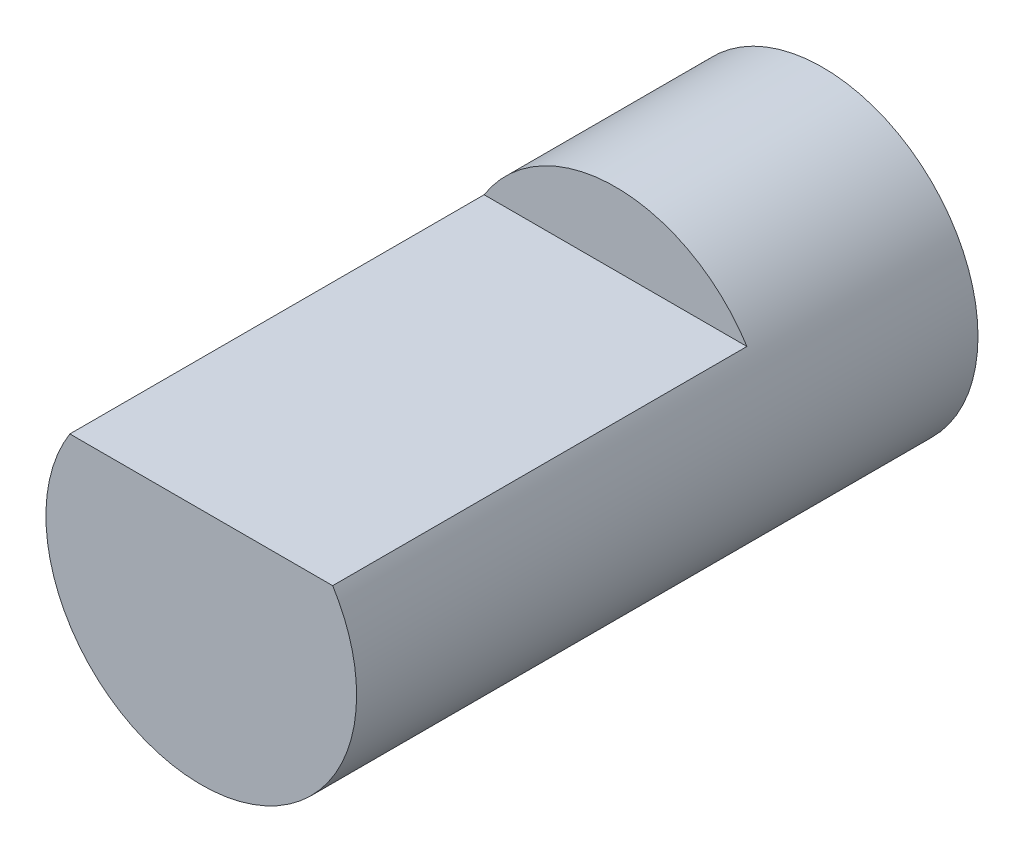
ISO-10303-21;
HEADER;
FILE_DESCRIPTION(('STEP AP214'),'2;1');
FILE_NAME('part.step','',(''),(''),'','','');
FILE_SCHEMA(('AUTOMOTIVE_DESIGN { 1 0 10303 214 1 1 1 1 }'));
ENDSEC;
DATA;
#1=APPLICATION_CONTEXT('core data for automotive mechanical design processes');
#2=APPLICATION_PROTOCOL_DEFINITION('international standard','automotive_design',2000,#1);
#3=PRODUCT_CONTEXT('',#1,'mechanical');
#4=PRODUCT('Part','Part','',(#3));
#5=PRODUCT_RELATED_PRODUCT_CATEGORY('part','',(#4));
#6=PRODUCT_DEFINITION_FORMATION('','',#4);
#7=PRODUCT_DEFINITION_CONTEXT('part definition',#1,'design');
#8=PRODUCT_DEFINITION('design','',#6,#7);
#9=PRODUCT_DEFINITION_SHAPE('','',#8);
#10=(LENGTH_UNIT() NAMED_UNIT(*) SI_UNIT(.MILLI.,.METRE.));
#11=(NAMED_UNIT(*) PLANE_ANGLE_UNIT() SI_UNIT($,.RADIAN.));
#12=(NAMED_UNIT(*) SI_UNIT($,.STERADIAN.) SOLID_ANGLE_UNIT());
#13=UNCERTAINTY_MEASURE_WITH_UNIT(LENGTH_MEASURE(1.E-05),#10,'distance_accuracy_value','');
#14=(GEOMETRIC_REPRESENTATION_CONTEXT(3) GLOBAL_UNCERTAINTY_ASSIGNED_CONTEXT((#13)) GLOBAL_UNIT_ASSIGNED_CONTEXT((#10,
#11,#12)) REPRESENTATION_CONTEXT('',''));
#15=CARTESIAN_POINT('',(0.,0.,0.));
#16=DIRECTION('',(0.,0.,1.));
#17=DIRECTION('',(1.,0.,0.));
#18=AXIS2_PLACEMENT_3D('',#15,#16,#17);
#19=CARTESIAN_POINT('',(0.,0.,-30.));
#20=DIRECTION('',(0.,0.,1.));
#21=DIRECTION('',(1.,0.,0.));
#22=AXIS2_PLACEMENT_3D('',#19,#20,#21);
#23=CYLINDRICAL_SURFACE('',#22,7.5);
#24=DIRECTION('',(0.,0.,1.));
#25=VECTOR('',#24,1.);
#26=CARTESIAN_POINT('',(6.34428877022476,4.,-20.));
#27=LINE('',#26,#25);
#28=CARTESIAN_POINT('',(6.34428877022476,4.,-20.));
#29=VERTEX_POINT('',#28);
#30=CARTESIAN_POINT('',(6.34428877022476,4.,0.));
#31=VERTEX_POINT('',#30);
#32=EDGE_CURVE('E59',#29,#31,#27,.T.);
#33=ORIENTED_EDGE('',*,*,#32,.T.);
#34=CARTESIAN_POINT('',(0.,0.,0.));
#35=DIRECTION('',(0.,0.,1.));
#36=DIRECTION('',(1.,0.,0.));
#37=AXIS2_PLACEMENT_3D('',#34,#35,#36);
#38=CIRCLE('',#37,7.5);
#39=CARTESIAN_POINT('',(-6.34428877022476,4.,0.));
#40=VERTEX_POINT('',#39);
#41=EDGE_CURVE('E42',#40,#31,#38,.T.);
#42=ORIENTED_EDGE('',*,*,#41,.F.);
#43=DIRECTION('',(0.,0.,1.));
#44=VECTOR('',#43,1.);
#45=CARTESIAN_POINT('',(-6.34428877022476,4.,-20.));
#46=LINE('',#45,#44);
#47=CARTESIAN_POINT('',(-6.34428877022476,4.,-20.));
#48=VERTEX_POINT('',#47);
#49=EDGE_CURVE('E53',#48,#40,#46,.T.);
#50=ORIENTED_EDGE('',*,*,#49,.F.);
#51=CARTESIAN_POINT('',(0.,0.,-20.));
#52=DIRECTION('',(0.,0.,1.));
#53=DIRECTION('',(-1.,0.,0.));
#54=AXIS2_PLACEMENT_3D('',#51,#52,#53);
#55=CIRCLE('',#54,7.5);
#56=EDGE_CURVE('E69',#29,#48,#55,.T.);
#57=ORIENTED_EDGE('',*,*,#56,.F.);
#58=EDGE_LOOP('',(#33,#42,#50,#57));
#59=FACE_BOUND('',#58,.T.);
#60=CARTESIAN_POINT('',(0.,0.,-30.));
#61=DIRECTION('',(0.,0.,1.));
#62=DIRECTION('',(1.,0.,0.));
#63=AXIS2_PLACEMENT_3D('',#60,#61,#62);
#64=CIRCLE('',#63,7.5);
#65=CARTESIAN_POINT('',(7.5,0.,-30.));
#66=VERTEX_POINT('',#65);
#67=EDGE_CURVE('E11',#66,#66,#64,.T.);
#68=ORIENTED_EDGE('',*,*,#67,.T.);
#69=EDGE_LOOP('',(#68));
#70=FACE_BOUND('',#69,.T.);
#71=ADVANCED_FACE('F39',(#59,#70),#23,.T.);
#72=CARTESIAN_POINT('',(0.,0.,-30.));
#73=DIRECTION('',(0.,0.,1.));
#74=DIRECTION('',(1.,0.,0.));
#75=AXIS2_PLACEMENT_3D('',#72,#73,#74);
#76=PLANE('',#75);
#77=ORIENTED_EDGE('',*,*,#67,.F.);
#78=EDGE_LOOP('',(#77));
#79=FACE_BOUND('',#78,.T.);
#80=ADVANCED_FACE('F77',(#79),#76,.F.);
#81=CARTESIAN_POINT('',(0.,0.,0.));
#82=DIRECTION('',(0.,0.,1.));
#83=DIRECTION('',(1.,0.,0.));
#84=AXIS2_PLACEMENT_3D('',#81,#82,#83);
#85=PLANE('',#84);
#86=DIRECTION('',(1.,0.,0.));
#87=VECTOR('',#86,1.);
#88=CARTESIAN_POINT('',(-6.34428877022476,4.,0.));
#89=LINE('',#88,#87);
#90=EDGE_CURVE('E64',#40,#31,#89,.T.);
#91=ORIENTED_EDGE('',*,*,#90,.F.);
#92=ORIENTED_EDGE('',*,*,#41,.T.);
#93=EDGE_LOOP('',(#91,#92));
#94=FACE_BOUND('',#93,.T.);
#95=ADVANCED_FACE('F75',(#94),#85,.T.);
#96=CARTESIAN_POINT('',(-6.34428877022476,4.,-20.));
#97=DIRECTION('',(0.,-1.,0.));
#98=DIRECTION('',(0.,0.,-1.));
#99=AXIS2_PLACEMENT_3D('',#96,#97,#98);
#100=PLANE('',#99);
#101=ORIENTED_EDGE('',*,*,#90,.T.);
#102=ORIENTED_EDGE('',*,*,#32,.F.);
#103=DIRECTION('',(1.,0.,0.));
#104=VECTOR('',#103,1.);
#105=CARTESIAN_POINT('',(-6.34428877022476,4.,-20.));
#106=LINE('',#105,#104);
#107=EDGE_CURVE('E138',#48,#29,#106,.T.);
#108=ORIENTED_EDGE('',*,*,#107,.F.);
#109=ORIENTED_EDGE('',*,*,#49,.T.);
#110=EDGE_LOOP('',(#101,#102,#108,#109));
#111=FACE_BOUND('',#110,.T.);
#112=ADVANCED_FACE('F65',(#111),#100,.F.);
#113=CARTESIAN_POINT('',(0.,0.,-20.));
#114=DIRECTION('',(0.,0.,-1.));
#115=DIRECTION('',(-1.,0.,0.));
#116=AXIS2_PLACEMENT_3D('',#113,#114,#115);
#117=PLANE('',#116);
#118=ORIENTED_EDGE('',*,*,#56,.T.);
#119=ORIENTED_EDGE('',*,*,#107,.T.);
#120=EDGE_LOOP('',(#118,#119));
#121=FACE_BOUND('',#120,.T.);
#122=ADVANCED_FACE('F82',(#121),#117,.F.);
#123=CLOSED_SHELL('',(#71,#80,#95,#112,#122));
#124=MANIFOLD_SOLID_BREP('B2',#123);
#125=ADVANCED_BREP_SHAPE_REPRESENTATION('',(#18,#124),#14);
#126=SHAPE_DEFINITION_REPRESENTATION(#9,#125);
ENDSEC;
END-ISO-10303-21;
